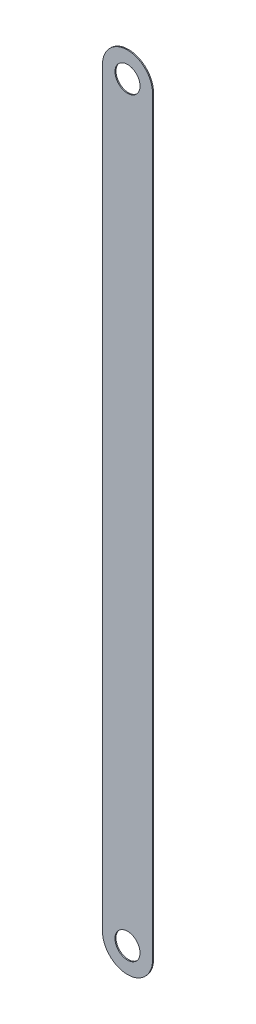
ISO-10303-21;
HEADER;
FILE_DESCRIPTION(('STEP AP214'),'2;1');
FILE_NAME('part.step','',(''),(''),'','','');
FILE_SCHEMA(('AUTOMOTIVE_DESIGN { 1 0 10303 214 1 1 1 1 }'));
ENDSEC;
DATA;
#1=APPLICATION_CONTEXT('core data for automotive mechanical design processes');
#2=APPLICATION_PROTOCOL_DEFINITION('international standard','automotive_design',2000,#1);
#3=PRODUCT_CONTEXT('',#1,'mechanical');
#4=PRODUCT('Part','Part','',(#3));
#5=PRODUCT_RELATED_PRODUCT_CATEGORY('part','',(#4));
#6=PRODUCT_DEFINITION_FORMATION('','',#4);
#7=PRODUCT_DEFINITION_CONTEXT('part definition',#1,'design');
#8=PRODUCT_DEFINITION('design','',#6,#7);
#9=PRODUCT_DEFINITION_SHAPE('','',#8);
#10=(LENGTH_UNIT() NAMED_UNIT(*) SI_UNIT(.MILLI.,.METRE.));
#11=(NAMED_UNIT(*) PLANE_ANGLE_UNIT() SI_UNIT($,.RADIAN.));
#12=(NAMED_UNIT(*) SI_UNIT($,.STERADIAN.) SOLID_ANGLE_UNIT());
#13=UNCERTAINTY_MEASURE_WITH_UNIT(LENGTH_MEASURE(1.E-05),#10,'distance_accuracy_value','');
#14=(GEOMETRIC_REPRESENTATION_CONTEXT(3) GLOBAL_UNCERTAINTY_ASSIGNED_CONTEXT((#13)) GLOBAL_UNIT_ASSIGNED_CONTEXT((#10,
#11,#12)) REPRESENTATION_CONTEXT('',''));
#15=CARTESIAN_POINT('',(0.,0.,0.));
#16=DIRECTION('',(0.,0.,1.));
#17=DIRECTION('',(1.,0.,0.));
#18=AXIS2_PLACEMENT_3D('',#15,#16,#17);
#19=CARTESIAN_POINT('',(0.,190.5,0.254));
#20=DIRECTION('',(0.,0.,1.));
#21=DIRECTION('',(1.,0.,0.));
#22=AXIS2_PLACEMENT_3D('',#19,#20,#21);
#23=PLANE('',#22);
#24=CARTESIAN_POINT('',(0.,190.5,0.254));
#25=DIRECTION('',(0.,0.,1.));
#26=DIRECTION('',(1.,0.,0.));
#27=AXIS2_PLACEMENT_3D('',#24,#25,#26);
#28=CIRCLE('',#27,3.17499999999999);
#29=CARTESIAN_POINT('',(3.17499999999999,190.5,0.254));
#30=VERTEX_POINT('',#29);
#31=EDGE_CURVE('E100',#30,#30,#28,.T.);
#32=ORIENTED_EDGE('',*,*,#31,.F.);
#33=EDGE_LOOP('',(#32));
#34=FACE_BOUND('',#33,.T.);
#35=CARTESIAN_POINT('',(0.,190.5,0.254));
#36=DIRECTION('',(0.,0.,1.));
#37=DIRECTION('',(1.,0.,0.));
#38=AXIS2_PLACEMENT_3D('',#35,#36,#37);
#39=CIRCLE('',#38,6.35);
#40=CARTESIAN_POINT('',(6.35,190.5,0.254));
#41=VERTEX_POINT('',#40);
#42=CARTESIAN_POINT('',(-6.35,190.5,0.254));
#43=VERTEX_POINT('',#42);
#44=EDGE_CURVE('E85',#41,#43,#39,.T.);
#45=ORIENTED_EDGE('',*,*,#44,.T.);
#46=DIRECTION('',(0.,-1.,0.));
#47=VECTOR('',#46,1.);
#48=CARTESIAN_POINT('',(-6.35,190.5,0.254));
#49=LINE('',#48,#47);
#50=CARTESIAN_POINT('',(-6.35,0.,0.254));
#51=VERTEX_POINT('',#50);
#52=EDGE_CURVE('E80',#43,#51,#49,.T.);
#53=ORIENTED_EDGE('',*,*,#52,.T.);
#54=CARTESIAN_POINT('',(0.,0.,0.254));
#55=DIRECTION('',(0.,0.,1.));
#56=DIRECTION('',(1.,0.,0.));
#57=AXIS2_PLACEMENT_3D('',#54,#55,#56);
#58=CIRCLE('',#57,6.35);
#59=CARTESIAN_POINT('',(6.35,0.,0.254));
#60=VERTEX_POINT('',#59);
#61=EDGE_CURVE('E83',#51,#60,#58,.T.);
#62=ORIENTED_EDGE('',*,*,#61,.T.);
#63=DIRECTION('',(0.,1.,0.));
#64=VECTOR('',#63,1.);
#65=CARTESIAN_POINT('',(6.35,190.5,0.254));
#66=LINE('',#65,#64);
#67=EDGE_CURVE('E50',#60,#41,#66,.T.);
#68=ORIENTED_EDGE('',*,*,#67,.T.);
#69=EDGE_LOOP('',(#45,#53,#62,#68));
#70=FACE_BOUND('',#69,.T.);
#71=CARTESIAN_POINT('',(0.,0.,0.254));
#72=DIRECTION('',(0.,0.,1.));
#73=DIRECTION('',(1.,0.,0.));
#74=AXIS2_PLACEMENT_3D('',#71,#72,#73);
#75=CIRCLE('',#74,3.175);
#76=CARTESIAN_POINT('',(3.175,0.,0.254));
#77=VERTEX_POINT('',#76);
#78=EDGE_CURVE('E115',#77,#77,#75,.T.);
#79=ORIENTED_EDGE('',*,*,#78,.F.);
#80=EDGE_LOOP('',(#79));
#81=FACE_BOUND('',#80,.T.);
#82=ADVANCED_FACE('F33',(#34,#70,#81),#23,.T.);
#83=CARTESIAN_POINT('',(0.,190.5,0.));
#84=DIRECTION('',(0.,0.,1.));
#85=DIRECTION('',(1.,0.,0.));
#86=AXIS2_PLACEMENT_3D('',#83,#84,#85);
#87=PLANE('',#86);
#88=CARTESIAN_POINT('',(0.,190.5,0.));
#89=DIRECTION('',(0.,0.,1.));
#90=DIRECTION('',(1.,0.,0.));
#91=AXIS2_PLACEMENT_3D('',#88,#89,#90);
#92=CIRCLE('',#91,6.35);
#93=CARTESIAN_POINT('',(6.35,190.5,0.));
#94=VERTEX_POINT('',#93);
#95=CARTESIAN_POINT('',(-6.35,190.5,0.));
#96=VERTEX_POINT('',#95);
#97=EDGE_CURVE('E97',#94,#96,#92,.T.);
#98=ORIENTED_EDGE('',*,*,#97,.F.);
#99=DIRECTION('',(0.,1.,0.));
#100=VECTOR('',#99,1.);
#101=CARTESIAN_POINT('',(6.35,190.5,0.));
#102=LINE('',#101,#100);
#103=CARTESIAN_POINT('',(6.35,0.,0.));
#104=VERTEX_POINT('',#103);
#105=EDGE_CURVE('E73',#104,#94,#102,.T.);
#106=ORIENTED_EDGE('',*,*,#105,.F.);
#107=CARTESIAN_POINT('',(0.,0.,0.));
#108=DIRECTION('',(0.,0.,1.));
#109=DIRECTION('',(1.,0.,0.));
#110=AXIS2_PLACEMENT_3D('',#107,#108,#109);
#111=CIRCLE('',#110,6.35);
#112=CARTESIAN_POINT('',(-6.35,0.,0.));
#113=VERTEX_POINT('',#112);
#114=EDGE_CURVE('E67',#113,#104,#111,.T.);
#115=ORIENTED_EDGE('',*,*,#114,.F.);
#116=DIRECTION('',(0.,-1.,0.));
#117=VECTOR('',#116,1.);
#118=CARTESIAN_POINT('',(-6.35,190.5,0.));
#119=LINE('',#118,#117);
#120=EDGE_CURVE('E89',#96,#113,#119,.T.);
#121=ORIENTED_EDGE('',*,*,#120,.F.);
#122=EDGE_LOOP('',(#98,#106,#115,#121));
#123=FACE_BOUND('',#122,.T.);
#124=CARTESIAN_POINT('',(0.,190.5,0.));
#125=DIRECTION('',(0.,0.,1.));
#126=DIRECTION('',(1.,0.,0.));
#127=AXIS2_PLACEMENT_3D('',#124,#125,#126);
#128=CIRCLE('',#127,3.17499999999999);
#129=CARTESIAN_POINT('',(3.17499999999999,190.5,0.));
#130=VERTEX_POINT('',#129);
#131=EDGE_CURVE('E112',#130,#130,#128,.T.);
#132=ORIENTED_EDGE('',*,*,#131,.T.);
#133=EDGE_LOOP('',(#132));
#134=FACE_BOUND('',#133,.T.);
#135=CARTESIAN_POINT('',(0.,0.,0.));
#136=DIRECTION('',(0.,0.,1.));
#137=DIRECTION('',(1.,0.,0.));
#138=AXIS2_PLACEMENT_3D('',#135,#136,#137);
#139=CIRCLE('',#138,3.175);
#140=CARTESIAN_POINT('',(3.175,0.,0.));
#141=VERTEX_POINT('',#140);
#142=EDGE_CURVE('E118',#141,#141,#139,.T.);
#143=ORIENTED_EDGE('',*,*,#142,.T.);
#144=EDGE_LOOP('',(#143));
#145=FACE_BOUND('',#144,.T.);
#146=ADVANCED_FACE('F108',(#123,#134,#145),#87,.F.);
#147=CARTESIAN_POINT('',(0.,190.5,0.254));
#148=DIRECTION('',(0.,0.,-1.));
#149=DIRECTION('',(-1.,0.,0.));
#150=AXIS2_PLACEMENT_3D('',#147,#148,#149);
#151=CYLINDRICAL_SURFACE('',#150,6.35);
#152=ORIENTED_EDGE('',*,*,#97,.T.);
#153=DIRECTION('',(0.,0.,-1.));
#154=VECTOR('',#153,1.);
#155=CARTESIAN_POINT('',(-6.35,190.5,0.254));
#156=LINE('',#155,#154);
#157=EDGE_CURVE('E11',#43,#96,#156,.T.);
#158=ORIENTED_EDGE('',*,*,#157,.F.);
#159=ORIENTED_EDGE('',*,*,#44,.F.);
#160=DIRECTION('',(0.,0.,-1.));
#161=VECTOR('',#160,1.);
#162=CARTESIAN_POINT('',(6.35,190.5,0.254));
#163=LINE('',#162,#161);
#164=EDGE_CURVE('E93',#41,#94,#163,.T.);
#165=ORIENTED_EDGE('',*,*,#164,.T.);
#166=EDGE_LOOP('',(#152,#158,#159,#165));
#167=FACE_BOUND('',#166,.T.);
#168=ADVANCED_FACE('F35',(#167),#151,.T.);
#169=CARTESIAN_POINT('',(-6.35,190.5,0.254));
#170=DIRECTION('',(1.,0.,0.));
#171=DIRECTION('',(0.,1.,0.));
#172=AXIS2_PLACEMENT_3D('',#169,#170,#171);
#173=PLANE('',#172);
#174=ORIENTED_EDGE('',*,*,#120,.T.);
#175=DIRECTION('',(0.,0.,-1.));
#176=VECTOR('',#175,1.);
#177=CARTESIAN_POINT('',(-6.35,0.,0.254));
#178=LINE('',#177,#176);
#179=EDGE_CURVE('E42',#51,#113,#178,.T.);
#180=ORIENTED_EDGE('',*,*,#179,.F.);
#181=ORIENTED_EDGE('',*,*,#52,.F.);
#182=ORIENTED_EDGE('',*,*,#157,.T.);
#183=EDGE_LOOP('',(#174,#180,#181,#182));
#184=FACE_BOUND('',#183,.T.);
#185=ADVANCED_FACE('F88',(#184),#173,.F.);
#186=CARTESIAN_POINT('',(0.,0.,0.254));
#187=DIRECTION('',(0.,0.,-1.));
#188=DIRECTION('',(-1.,0.,0.));
#189=AXIS2_PLACEMENT_3D('',#186,#187,#188);
#190=CYLINDRICAL_SURFACE('',#189,6.35);
#191=ORIENTED_EDGE('',*,*,#114,.T.);
#192=DIRECTION('',(0.,0.,-1.));
#193=VECTOR('',#192,1.);
#194=CARTESIAN_POINT('',(6.35,0.,0.254));
#195=LINE('',#194,#193);
#196=EDGE_CURVE('E90',#60,#104,#195,.T.);
#197=ORIENTED_EDGE('',*,*,#196,.F.);
#198=ORIENTED_EDGE('',*,*,#61,.F.);
#199=ORIENTED_EDGE('',*,*,#179,.T.);
#200=EDGE_LOOP('',(#191,#197,#198,#199));
#201=FACE_BOUND('',#200,.T.);
#202=ADVANCED_FACE('F91',(#201),#190,.T.);
#203=CARTESIAN_POINT('',(6.35,190.5,0.254));
#204=DIRECTION('',(-1.,0.,0.));
#205=DIRECTION('',(0.,-1.,0.));
#206=AXIS2_PLACEMENT_3D('',#203,#204,#205);
#207=PLANE('',#206);
#208=ORIENTED_EDGE('',*,*,#105,.T.);
#209=ORIENTED_EDGE('',*,*,#164,.F.);
#210=ORIENTED_EDGE('',*,*,#67,.F.);
#211=ORIENTED_EDGE('',*,*,#196,.T.);
#212=EDGE_LOOP('',(#208,#209,#210,#211));
#213=FACE_BOUND('',#212,.T.);
#214=ADVANCED_FACE('F105',(#213),#207,.F.);
#215=CARTESIAN_POINT('',(0.,190.5,0.254));
#216=DIRECTION('',(0.,0.,-1.));
#217=DIRECTION('',(-1.,0.,0.));
#218=AXIS2_PLACEMENT_3D('',#215,#216,#217);
#219=CYLINDRICAL_SURFACE('',#218,3.17499999999999);
#220=ORIENTED_EDGE('',*,*,#31,.T.);
#221=EDGE_LOOP('',(#220));
#222=FACE_BOUND('',#221,.T.);
#223=ORIENTED_EDGE('',*,*,#131,.F.);
#224=EDGE_LOOP('',(#223));
#225=FACE_BOUND('',#224,.T.);
#226=ADVANCED_FACE('F135',(#222,#225),#219,.F.);
#227=CARTESIAN_POINT('',(0.,0.,0.254));
#228=DIRECTION('',(0.,0.,-1.));
#229=DIRECTION('',(-1.,0.,0.));
#230=AXIS2_PLACEMENT_3D('',#227,#228,#229);
#231=CYLINDRICAL_SURFACE('',#230,3.175);
#232=ORIENTED_EDGE('',*,*,#78,.T.);
#233=EDGE_LOOP('',(#232));
#234=FACE_BOUND('',#233,.T.);
#235=ORIENTED_EDGE('',*,*,#142,.F.);
#236=EDGE_LOOP('',(#235));
#237=FACE_BOUND('',#236,.T.);
#238=ADVANCED_FACE('F124',(#234,#237),#231,.F.);
#239=CLOSED_SHELL('',(#82,#146,#168,#185,#202,#214,#226,#238));
#240=MANIFOLD_SOLID_BREP('B2',#239);
#241=ADVANCED_BREP_SHAPE_REPRESENTATION('',(#18,#240),#14);
#242=SHAPE_DEFINITION_REPRESENTATION(#9,#241);
ENDSEC;
END-ISO-10303-21;
